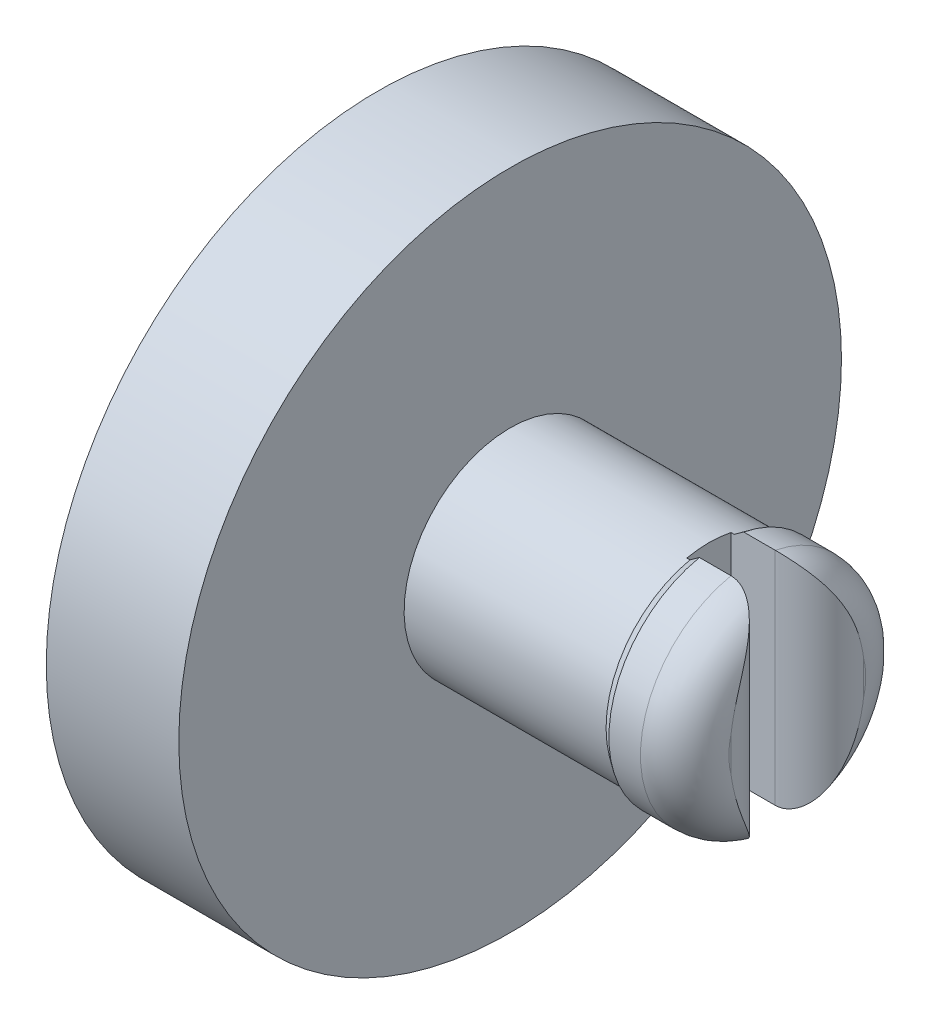
ISO-10303-21;
HEADER;
FILE_DESCRIPTION(('STEP AP214'),'2;1');
FILE_NAME('part.step','',(''),(''),'','','');
FILE_SCHEMA(('AUTOMOTIVE_DESIGN { 1 0 10303 214 1 1 1 1 }'));
ENDSEC;
DATA;
#1=APPLICATION_CONTEXT('core data for automotive mechanical design processes');
#2=APPLICATION_PROTOCOL_DEFINITION('international standard','automotive_design',2000,#1);
#3=PRODUCT_CONTEXT('',#1,'mechanical');
#4=PRODUCT('Part','Part','',(#3));
#5=PRODUCT_RELATED_PRODUCT_CATEGORY('part','',(#4));
#6=PRODUCT_DEFINITION_FORMATION('','',#4);
#7=PRODUCT_DEFINITION_CONTEXT('part definition',#1,'design');
#8=PRODUCT_DEFINITION('design','',#6,#7);
#9=PRODUCT_DEFINITION_SHAPE('','',#8);
#10=(LENGTH_UNIT() NAMED_UNIT(*) SI_UNIT(.MILLI.,.METRE.));
#11=(NAMED_UNIT(*) PLANE_ANGLE_UNIT() SI_UNIT($,.RADIAN.));
#12=(NAMED_UNIT(*) SI_UNIT($,.STERADIAN.) SOLID_ANGLE_UNIT());
#13=UNCERTAINTY_MEASURE_WITH_UNIT(LENGTH_MEASURE(1.E-05),#10,'distance_accuracy_value','');
#14=(GEOMETRIC_REPRESENTATION_CONTEXT(3) GLOBAL_UNCERTAINTY_ASSIGNED_CONTEXT((#13)) GLOBAL_UNIT_ASSIGNED_CONTEXT((#10,
#11,#12)) REPRESENTATION_CONTEXT('',''));
#15=CARTESIAN_POINT('',(0.,0.,0.));
#16=DIRECTION('',(0.,0.,1.));
#17=DIRECTION('',(1.,0.,0.));
#18=AXIS2_PLACEMENT_3D('',#15,#16,#17);
#19=CARTESIAN_POINT('',(3.,0.,0.));
#20=DIRECTION('',(-1.,0.,0.));
#21=DIRECTION('',(0.,0.,1.));
#22=AXIS2_PLACEMENT_3D('',#19,#20,#21);
#23=CYLINDRICAL_SURFACE('',#22,7.5);
#24=CARTESIAN_POINT('',(3.,0.,0.));
#25=DIRECTION('',(1.,0.,0.));
#26=DIRECTION('',(0.,0.,-1.));
#27=AXIS2_PLACEMENT_3D('',#24,#25,#26);
#28=CIRCLE('',#27,7.5);
#29=CARTESIAN_POINT('',(3.,0.,-7.5));
#30=VERTEX_POINT('',#29);
#31=EDGE_CURVE('E318',#30,#30,#28,.T.);
#32=ORIENTED_EDGE('',*,*,#31,.F.);
#33=EDGE_LOOP('',(#32));
#34=FACE_BOUND('',#33,.T.);
#35=CARTESIAN_POINT('',(0.,0.,0.));
#36=DIRECTION('',(1.,0.,0.));
#37=DIRECTION('',(0.,0.,-1.));
#38=AXIS2_PLACEMENT_3D('',#35,#36,#37);
#39=CIRCLE('',#38,7.5);
#40=CARTESIAN_POINT('',(0.,0.,-7.5));
#41=VERTEX_POINT('',#40);
#42=EDGE_CURVE('E314',#41,#41,#39,.T.);
#43=ORIENTED_EDGE('',*,*,#42,.T.);
#44=EDGE_LOOP('',(#43));
#45=FACE_BOUND('',#44,.T.);
#46=ADVANCED_FACE('F47',(#34,#45),#23,.T.);
#47=CARTESIAN_POINT('',(3.,0.,0.));
#48=DIRECTION('',(1.,0.,0.));
#49=DIRECTION('',(0.,0.,-1.));
#50=AXIS2_PLACEMENT_3D('',#47,#48,#49);
#51=PLANE('',#50);
#52=CARTESIAN_POINT('',(3.,0.,0.));
#53=DIRECTION('',(1.,0.,0.));
#54=DIRECTION('',(0.,0.,-1.));
#55=AXIS2_PLACEMENT_3D('',#52,#53,#54);
#56=CIRCLE('',#55,2.4);
#57=CARTESIAN_POINT('',(3.,0.,-2.4));
#58=VERTEX_POINT('',#57);
#59=EDGE_CURVE('E299',#58,#58,#56,.T.);
#60=ORIENTED_EDGE('',*,*,#59,.F.);
#61=EDGE_LOOP('',(#60));
#62=FACE_BOUND('',#61,.T.);
#63=ORIENTED_EDGE('',*,*,#31,.T.);
#64=EDGE_LOOP('',(#63));
#65=FACE_BOUND('',#64,.T.);
#66=ADVANCED_FACE('F267',(#62,#65),#51,.T.);
#67=CARTESIAN_POINT('',(0.,0.,0.));
#68=DIRECTION('',(1.,0.,0.));
#69=DIRECTION('',(0.,0.,-1.));
#70=AXIS2_PLACEMENT_3D('',#67,#68,#69);
#71=PLANE('',#70);
#72=ORIENTED_EDGE('',*,*,#42,.F.);
#73=EDGE_LOOP('',(#72));
#74=FACE_BOUND('',#73,.T.);
#75=ADVANCED_FACE('F269',(#74),#71,.F.);
#76=CARTESIAN_POINT('',(7.5,0.,0.));
#77=DIRECTION('',(-1.,0.,0.));
#78=DIRECTION('',(0.,0.,1.));
#79=AXIS2_PLACEMENT_3D('',#76,#77,#78);
#80=CYLINDRICAL_SURFACE('',#79,2.4);
#81=CARTESIAN_POINT('',(7.5,0.,0.));
#82=DIRECTION('',(1.,0.,0.));
#83=DIRECTION('',(0.,0.,-1.));
#84=AXIS2_PLACEMENT_3D('',#81,#82,#83);
#85=CIRCLE('',#84,2.4);
#86=CARTESIAN_POINT('',(7.5,2.3473389188611,-0.500000000000001));
#87=VERTEX_POINT('',#86);
#88=CARTESIAN_POINT('',(7.5,2.3473389188611,0.499999999999999));
#89=VERTEX_POINT('',#88);
#90=EDGE_CURVE('E285',#87,#89,#85,.T.);
#91=ORIENTED_EDGE('',*,*,#90,.F.);
#92=DIRECTION('',(-1.,0.,0.));
#93=VECTOR('',#92,1.);
#94=CARTESIAN_POINT('',(7.57140740033711,2.3473389188611,-0.500000000000001));
#95=LINE('',#94,#93);
#96=CARTESIAN_POINT('',(7.57140740033711,2.3473389188611,-0.500000000000001));
#97=VERTEX_POINT('',#96);
#98=EDGE_CURVE('E77',#97,#87,#95,.T.);
#99=ORIENTED_EDGE('',*,*,#98,.F.);
#100=CARTESIAN_POINT('',(7.57140740033711,0.,0.));
#101=DIRECTION('',(1.,0.,0.));
#102=DIRECTION('',(0.,0.,-1.));
#103=AXIS2_PLACEMENT_3D('',#100,#101,#102);
#104=CIRCLE('',#103,2.4);
#105=CARTESIAN_POINT('',(7.57140740033711,-2.3473389188611,-0.500000000000001));
#106=VERTEX_POINT('',#105);
#107=EDGE_CURVE('E59',#97,#106,#104,.F.);
#108=ORIENTED_EDGE('',*,*,#107,.T.);
#109=DIRECTION('',(-1.,0.,0.));
#110=VECTOR('',#109,1.);
#111=CARTESIAN_POINT('',(7.5,-2.3473389188611,-0.500000000000001));
#112=LINE('',#111,#110);
#113=CARTESIAN_POINT('',(7.5,-2.3473389188611,-0.500000000000001));
#114=VERTEX_POINT('',#113);
#115=EDGE_CURVE('E179',#114,#106,#112,.F.);
#116=ORIENTED_EDGE('',*,*,#115,.F.);
#117=CARTESIAN_POINT('',(7.5,-2.3473389188611,0.499999999999999));
#118=VERTEX_POINT('',#117);
#119=EDGE_CURVE('E103',#118,#114,#85,.T.);
#120=ORIENTED_EDGE('',*,*,#119,.F.);
#121=DIRECTION('',(-1.,0.,0.));
#122=VECTOR('',#121,1.);
#123=CARTESIAN_POINT('',(7.57140740033711,-2.3473389188611,0.499999999999999));
#124=LINE('',#123,#122);
#125=CARTESIAN_POINT('',(7.57140740033711,-2.3473389188611,0.499999999999999));
#126=VERTEX_POINT('',#125);
#127=EDGE_CURVE('E97',#126,#118,#124,.T.);
#128=ORIENTED_EDGE('',*,*,#127,.F.);
#129=CARTESIAN_POINT('',(7.57140740033711,0.,0.));
#130=DIRECTION('',(1.,0.,0.));
#131=DIRECTION('',(0.,0.,-1.));
#132=AXIS2_PLACEMENT_3D('',#129,#130,#131);
#133=CIRCLE('',#132,2.4);
#134=CARTESIAN_POINT('',(7.57140740033711,2.3473389188611,0.499999999999999));
#135=VERTEX_POINT('',#134);
#136=EDGE_CURVE('E11',#126,#135,#133,.F.);
#137=ORIENTED_EDGE('',*,*,#136,.T.);
#138=DIRECTION('',(-1.,0.,0.));
#139=VECTOR('',#138,1.);
#140=CARTESIAN_POINT('',(7.5,2.3473389188611,0.499999999999999));
#141=LINE('',#140,#139);
#142=EDGE_CURVE('E66',#89,#135,#141,.F.);
#143=ORIENTED_EDGE('',*,*,#142,.F.);
#144=EDGE_LOOP('',(#91,#99,#108,#116,#120,#128,#137,#143));
#145=FACE_BOUND('',#144,.T.);
#146=ORIENTED_EDGE('',*,*,#59,.T.);
#147=EDGE_LOOP('',(#146));
#148=FACE_BOUND('',#147,.T.);
#149=ADVANCED_FACE('F99',(#145,#148),#80,.T.);
#150=CARTESIAN_POINT('',(7.5,0.,0.));
#151=DIRECTION('',(1.,0.,0.));
#152=DIRECTION('',(0.,0.,-1.));
#153=AXIS2_PLACEMENT_3D('',#150,#151,#152);
#154=PLANE('',#153);
#155=DIRECTION('',(0.,1.,0.));
#156=VECTOR('',#155,1.);
#157=CARTESIAN_POINT('',(7.5,-2.50049995001,0.499999999999999));
#158=LINE('',#157,#156);
#159=EDGE_CURVE('E283',#118,#89,#158,.T.);
#160=ORIENTED_EDGE('',*,*,#159,.F.);
#161=ORIENTED_EDGE('',*,*,#119,.T.);
#162=DIRECTION('',(0.,-1.,0.));
#163=VECTOR('',#162,1.);
#164=CARTESIAN_POINT('',(7.5,2.50049995001,-0.500000000000001));
#165=LINE('',#164,#163);
#166=EDGE_CURVE('E291',#87,#114,#165,.T.);
#167=ORIENTED_EDGE('',*,*,#166,.F.);
#168=ORIENTED_EDGE('',*,*,#90,.T.);
#169=EDGE_LOOP('',(#160,#161,#167,#168));
#170=FACE_BOUND('',#169,.T.);
#171=ADVANCED_FACE('F156',(#170),#154,.T.);
#172=CARTESIAN_POINT('',(9.5,0.,0.));
#173=DIRECTION('',(-1.,0.,0.));
#174=DIRECTION('',(0.,0.,1.));
#175=AXIS2_PLACEMENT_3D('',#172,#173,#174);
#176=CYLINDRICAL_SURFACE('',#175,2.55);
#177=DIRECTION('',(-1.,0.,0.));
#178=VECTOR('',#177,1.);
#179=CARTESIAN_POINT('',(9.5,-2.50049995001,-0.500000000000001));
#180=LINE('',#179,#178);
#181=CARTESIAN_POINT('',(8.5,-2.50049995001,-0.500000000000001));
#182=VERTEX_POINT('',#181);
#183=CARTESIAN_POINT('',(7.78562960134843,-2.50049995001,-0.500000000000001));
#184=VERTEX_POINT('',#183);
#185=EDGE_CURVE('E305',#182,#184,#180,.T.);
#186=ORIENTED_EDGE('',*,*,#185,.T.);
#187=CARTESIAN_POINT('',(7.78562960134843,0.,0.));
#188=DIRECTION('',(1.,0.,0.));
#189=DIRECTION('',(0.,0.,-1.));
#190=AXIS2_PLACEMENT_3D('',#187,#188,#189);
#191=CIRCLE('',#190,2.55);
#192=CARTESIAN_POINT('',(7.78562960134843,2.50049995001,-0.500000000000001));
#193=VERTEX_POINT('',#192);
#194=EDGE_CURVE('E215',#184,#193,#191,.T.);
#195=ORIENTED_EDGE('',*,*,#194,.T.);
#196=DIRECTION('',(-1.,0.,0.));
#197=VECTOR('',#196,1.);
#198=CARTESIAN_POINT('',(9.5,2.50049995001,-0.500000000000001));
#199=LINE('',#198,#197);
#200=CARTESIAN_POINT('',(8.5,2.50049995001,-0.500000000000001));
#201=VERTEX_POINT('',#200);
#202=EDGE_CURVE('E252',#201,#193,#199,.T.);
#203=ORIENTED_EDGE('',*,*,#202,.F.);
#204=CARTESIAN_POINT('',(8.5,0.,0.));
#205=DIRECTION('',(1.,0.,0.));
#206=DIRECTION('',(0.,0.,-1.));
#207=AXIS2_PLACEMENT_3D('',#204,#205,#206);
#208=CIRCLE('',#207,2.55);
#209=EDGE_CURVE('E218',#201,#182,#208,.F.);
#210=ORIENTED_EDGE('',*,*,#209,.T.);
#211=EDGE_LOOP('',(#186,#195,#203,#210));
#212=FACE_BOUND('',#211,.T.);
#213=ADVANCED_FACE('F152',(#212),#176,.T.);
#214=CARTESIAN_POINT('',(9.5,2.50049995001,-0.500000000000001));
#215=DIRECTION('',(0.,0.,-1.));
#216=DIRECTION('',(-1.,0.,0.));
#217=AXIS2_PLACEMENT_3D('',#214,#215,#216);
#218=PLANE('',#217);
#219=CARTESIAN_POINT('',(7.78562960134843,2.50049995001,-0.500000000000001));
#220=CARTESIAN_POINT('',(7.73799603494508,2.46648873898344,-0.500000000000001));
#221=CARTESIAN_POINT('',(7.69037678513601,2.4324575128124,-0.500000000000001));
#222=CARTESIAN_POINT('',(7.59516691801945,2.36435502968998,-0.500000000000001));
#223=CARTESIAN_POINT('',(7.54757630071238,2.33028377273802,-0.500000000000001));
#224=CARTESIAN_POINT('',(7.5,2.296192500641,-0.500000000000001));
#225=B_SPLINE_CURVE_WITH_KNOTS('',3,(#219,#220,#221,#222,#223,#224),.UNSPECIFIED.,.F.,.F.,(4,2,
4),(0.,0.175588882802255,0.351177768138415),.UNSPECIFIED.);
#226=EDGE_CURVE('E173',#193,#97,#225,.T.);
#227=ORIENTED_EDGE('',*,*,#226,.T.);
#228=ORIENTED_EDGE('',*,*,#98,.T.);
#229=ORIENTED_EDGE('',*,*,#166,.T.);
#230=ORIENTED_EDGE('',*,*,#115,.T.);
#231=CARTESIAN_POINT('',(7.5,-2.296192500641,-0.500000000000001));
#232=CARTESIAN_POINT('',(7.54757630071238,-2.33028377273802,-0.500000000000001));
#233=CARTESIAN_POINT('',(7.59516691801945,-2.36435502968998,-0.500000000000001));
#234=CARTESIAN_POINT('',(7.69037678513601,-2.4324575128124,-0.500000000000001));
#235=CARTESIAN_POINT('',(7.73799603494508,-2.46648873898344,-0.500000000000001));
#236=CARTESIAN_POINT('',(7.78562960134843,-2.50049995001,-0.500000000000001));
#237=B_SPLINE_CURVE_WITH_KNOTS('',3,(#231,#232,#233,#234,#235,#236),.UNSPECIFIED.,.F.,.F.,(4,2,
4),(0.,0.175588885336159,0.351177768138415),.UNSPECIFIED.);
#238=EDGE_CURVE('E165',#106,#184,#237,.T.);
#239=ORIENTED_EDGE('',*,*,#238,.T.);
#240=ORIENTED_EDGE('',*,*,#185,.F.);
#241=DIRECTION('',(0.,-1.,0.));
#242=VECTOR('',#241,1.);
#243=CARTESIAN_POINT('',(8.5,2.50049995001,-0.500000000000001));
#244=LINE('',#243,#242);
#245=EDGE_CURVE('E226',#182,#201,#244,.F.);
#246=ORIENTED_EDGE('',*,*,#245,.T.);
#247=ORIENTED_EDGE('',*,*,#202,.T.);
#248=EDGE_LOOP('',(#227,#228,#229,#230,#239,#240,#246,#247));
#249=FACE_BOUND('',#248,.T.);
#250=ADVANCED_FACE('F155',(#249),#218,.F.);
#251=CARTESIAN_POINT('',(9.5,0.,0.));
#252=DIRECTION('',(1.,0.,0.));
#253=DIRECTION('',(0.,0.,-1.));
#254=AXIS2_PLACEMENT_3D('',#251,#252,#253);
#255=PLANE('',#254);
#256=CARTESIAN_POINT('',(9.5,0.,0.));
#257=DIRECTION('',(1.,0.,0.));
#258=DIRECTION('',(0.,0.,-1.));
#259=AXIS2_PLACEMENT_3D('',#256,#257,#258);
#260=CIRCLE('',#259,1.55);
#261=CARTESIAN_POINT('',(9.5,-0.390512483812212,-1.49999999999561));
#262=VERTEX_POINT('',#261);
#263=CARTESIAN_POINT('',(9.5,0.390512483812212,-1.49999999999561));
#264=VERTEX_POINT('',#263);
#265=EDGE_CURVE('E238',#262,#264,#260,.T.);
#266=ORIENTED_EDGE('',*,*,#265,.T.);
#267=DIRECTION('',(0.,-1.,0.));
#268=VECTOR('',#267,1.);
#269=CARTESIAN_POINT('',(9.5,-2.50049995001,-1.5));
#270=LINE('',#269,#268);
#271=EDGE_CURVE('E232',#264,#262,#270,.T.);
#272=ORIENTED_EDGE('',*,*,#271,.T.);
#273=EDGE_LOOP('',(#266,#272));
#274=FACE_BOUND('',#273,.T.);
#275=ADVANCED_FACE('F150',(#274),#255,.T.);
#276=CARTESIAN_POINT('',(9.5,0.,0.));
#277=DIRECTION('',(-1.,0.,0.));
#278=DIRECTION('',(0.,0.,1.));
#279=AXIS2_PLACEMENT_3D('',#276,#277,#278);
#280=CYLINDRICAL_SURFACE('',#279,2.55);
#281=DIRECTION('',(-1.,0.,0.));
#282=VECTOR('',#281,1.);
#283=CARTESIAN_POINT('',(9.5,2.50049995001,0.499999999999999));
#284=LINE('',#283,#282);
#285=CARTESIAN_POINT('',(8.5,2.50049995001,0.499999999999999));
#286=VERTEX_POINT('',#285);
#287=CARTESIAN_POINT('',(7.78562960134843,2.50049995001,0.499999999999999));
#288=VERTEX_POINT('',#287);
#289=EDGE_CURVE('E302',#286,#288,#284,.T.);
#290=ORIENTED_EDGE('',*,*,#289,.T.);
#291=CARTESIAN_POINT('',(7.78562960134843,0.,0.));
#292=DIRECTION('',(1.,0.,0.));
#293=DIRECTION('',(0.,0.,-1.));
#294=AXIS2_PLACEMENT_3D('',#291,#292,#293);
#295=CIRCLE('',#294,2.55);
#296=CARTESIAN_POINT('',(7.78562960134843,-2.50049995001,0.499999999999999));
#297=VERTEX_POINT('',#296);
#298=EDGE_CURVE('E121',#288,#297,#295,.T.);
#299=ORIENTED_EDGE('',*,*,#298,.T.);
#300=DIRECTION('',(-1.,0.,0.));
#301=VECTOR('',#300,1.);
#302=CARTESIAN_POINT('',(9.5,-2.50049995001,0.499999999999999));
#303=LINE('',#302,#301);
#304=CARTESIAN_POINT('',(8.5,-2.50049995001,0.499999999999999));
#305=VERTEX_POINT('',#304);
#306=EDGE_CURVE('E113',#305,#297,#303,.T.);
#307=ORIENTED_EDGE('',*,*,#306,.F.);
#308=CARTESIAN_POINT('',(8.5,0.,0.));
#309=DIRECTION('',(1.,0.,0.));
#310=DIRECTION('',(0.,0.,-1.));
#311=AXIS2_PLACEMENT_3D('',#308,#309,#310);
#312=CIRCLE('',#311,2.55);
#313=EDGE_CURVE('E242',#305,#286,#312,.F.);
#314=ORIENTED_EDGE('',*,*,#313,.T.);
#315=EDGE_LOOP('',(#290,#299,#307,#314));
#316=FACE_BOUND('',#315,.T.);
#317=ADVANCED_FACE('F141',(#316),#280,.T.);
#318=CARTESIAN_POINT('',(9.5,-2.50049995001,0.499999999999999));
#319=DIRECTION('',(0.,0.,1.));
#320=DIRECTION('',(1.,0.,0.));
#321=AXIS2_PLACEMENT_3D('',#318,#319,#320);
#322=PLANE('',#321);
#323=CARTESIAN_POINT('',(7.78562960134843,-2.50049995001,0.499999999999999));
#324=CARTESIAN_POINT('',(7.73799603494508,-2.46648873898344,0.499999999999999));
#325=CARTESIAN_POINT('',(7.69037678513601,-2.4324575128124,0.499999999999999));
#326=CARTESIAN_POINT('',(7.59516691801945,-2.36435502968998,0.499999999999999));
#327=CARTESIAN_POINT('',(7.54757630071238,-2.33028377273802,0.499999999999999));
#328=CARTESIAN_POINT('',(7.5,-2.296192500641,0.499999999999999));
#329=B_SPLINE_CURVE_WITH_KNOTS('',3,(#323,#324,#325,#326,#327,#328),.UNSPECIFIED.,.F.,.F.,(4,2,
4),(0.,0.175588882802255,0.351177768138414),.UNSPECIFIED.);
#330=EDGE_CURVE('E107',#297,#126,#329,.T.);
#331=ORIENTED_EDGE('',*,*,#330,.T.);
#332=ORIENTED_EDGE('',*,*,#127,.T.);
#333=ORIENTED_EDGE('',*,*,#159,.T.);
#334=ORIENTED_EDGE('',*,*,#142,.T.);
#335=CARTESIAN_POINT('',(7.5,2.29619250064101,0.499999999999999));
#336=CARTESIAN_POINT('',(7.54757630071238,2.33028377273802,0.499999999999999));
#337=CARTESIAN_POINT('',(7.59516691801945,2.36435502968999,0.499999999999999));
#338=CARTESIAN_POINT('',(7.69037678513601,2.43245751281241,0.499999999999999));
#339=CARTESIAN_POINT('',(7.73799603494508,2.46648873898344,0.499999999999999));
#340=CARTESIAN_POINT('',(7.78562960134843,2.50049995001,0.499999999999999));
#341=B_SPLINE_CURVE_WITH_KNOTS('',3,(#335,#336,#337,#338,#339,#340),.UNSPECIFIED.,.F.,.F.,(4,2,
4),(0.,0.175588885336159,0.351177768138414),.UNSPECIFIED.);
#342=EDGE_CURVE('E120',#135,#288,#341,.T.);
#343=ORIENTED_EDGE('',*,*,#342,.T.);
#344=ORIENTED_EDGE('',*,*,#289,.F.);
#345=DIRECTION('',(0.,1.,0.));
#346=VECTOR('',#345,1.);
#347=CARTESIAN_POINT('',(8.5,-2.50049995001,0.499999999999999));
#348=LINE('',#347,#346);
#349=EDGE_CURVE('E328',#286,#305,#348,.F.);
#350=ORIENTED_EDGE('',*,*,#349,.T.);
#351=ORIENTED_EDGE('',*,*,#306,.T.);
#352=EDGE_LOOP('',(#331,#332,#333,#334,#343,#344,#350,#351));
#353=FACE_BOUND('',#352,.T.);
#354=ADVANCED_FACE('F110',(#353),#322,.F.);
#355=CARTESIAN_POINT('',(9.5,0.,0.));
#356=DIRECTION('',(1.,0.,0.));
#357=DIRECTION('',(0.,0.,-1.));
#358=AXIS2_PLACEMENT_3D('',#355,#356,#357);
#359=PLANE('',#358);
#360=CARTESIAN_POINT('',(9.5,0.,0.));
#361=DIRECTION('',(1.,0.,0.));
#362=DIRECTION('',(0.,0.,-1.));
#363=AXIS2_PLACEMENT_3D('',#360,#361,#362);
#364=CIRCLE('',#363,1.55);
#365=CARTESIAN_POINT('',(9.5,0.39051248381222,1.4999999999956));
#366=VERTEX_POINT('',#365);
#367=CARTESIAN_POINT('',(9.5,-0.39051248381222,1.4999999999956));
#368=VERTEX_POINT('',#367);
#369=EDGE_CURVE('E290',#366,#368,#364,.T.);
#370=ORIENTED_EDGE('',*,*,#369,.T.);
#371=DIRECTION('',(0.,1.,0.));
#372=VECTOR('',#371,1.);
#373=CARTESIAN_POINT('',(9.5,2.50049995001,1.5));
#374=LINE('',#373,#372);
#375=EDGE_CURVE('E296',#368,#366,#374,.T.);
#376=ORIENTED_EDGE('',*,*,#375,.T.);
#377=EDGE_LOOP('',(#370,#376));
#378=FACE_BOUND('',#377,.T.);
#379=ADVANCED_FACE('F140',(#378),#359,.T.);
#380=CARTESIAN_POINT('',(8.5,0.,0.));
#381=DIRECTION('',(1.,0.,0.));
#382=DIRECTION('',(0.,0.,-1.));
#383=AXIS2_PLACEMENT_3D('',#380,#381,#382);
#384=TOROIDAL_SURFACE('',#383,1.55,1.);
#385=CARTESIAN_POINT('',(8.5,2.50049995001,0.499999999999999));
#386=CARTESIAN_POINT('',(8.52062037812451,2.50050262481934,0.499996815981459));
#387=CARTESIAN_POINT('',(8.54122738672376,2.49972131781612,0.500638435365421));
#388=CARTESIAN_POINT('',(8.58223103772199,2.49662410586011,0.50317569670102));
#389=CARTESIAN_POINT('',(8.60262784180595,2.49430948630705,0.505070288264396));
#390=CARTESIAN_POINT('',(8.66287019167039,2.48517574092105,0.51253114662379));
#391=CARTESIAN_POINT('',(8.70219184922865,2.47616515120073,0.519876100327871));
#392=CARTESIAN_POINT('',(8.77804017934073,2.45294819674788,0.538635507971327));
#393=CARTESIAN_POINT('',(8.81457467282006,2.43875706995295,0.550038024613098));
#394=CARTESIAN_POINT('',(8.88442351779282,2.40595711760122,0.576088569155384));
#395=CARTESIAN_POINT('',(8.91772998418651,2.38733784008625,0.59074427014983));
#396=CARTESIAN_POINT('',(8.99384680600395,2.33801444662052,0.629019136575283));
#397=CARTESIAN_POINT('',(9.03487653673112,2.30549970294828,0.653836081497237));
#398=CARTESIAN_POINT('',(9.10994399010374,2.2351174345998,0.706229167768838));
#399=CARTESIAN_POINT('',(9.14396856029015,2.19724006230109,0.7338103573744));
#400=CARTESIAN_POINT('',(9.22176695376173,2.09666839581951,0.80494094517632));
#401=CARTESIAN_POINT('',(9.26136048052717,2.03133964964426,0.849311183475504));
#402=CARTESIAN_POINT('',(9.32859369432637,1.89447274358894,0.937409900698313));
#403=CARTESIAN_POINT('',(9.35620649945363,1.82292104795453,0.981136725914945));
#404=CARTESIAN_POINT('',(9.41207075004341,1.64322892360475,1.08417550983467));
#405=CARTESIAN_POINT('',(9.43537367331539,1.53271318976298,1.14199154682244));
#406=CARTESIAN_POINT('',(9.46924640739032,1.30545924867845,1.24774428955149));
#407=CARTESIAN_POINT('',(9.47981692414304,1.18872138679712,1.29568154290092));
#408=CARTESIAN_POINT('',(9.49359295907356,0.950328372084177,1.37927469357639));
#409=CARTESIAN_POINT('',(9.49678904542798,0.828667124314529,1.41491481352631));
#410=CARTESIAN_POINT('',(9.49926965669103,0.638681349319053,1.45886084571995));
#411=CARTESIAN_POINT('',(9.49967610051195,0.57149904069477,1.47220519531089));
#412=CARTESIAN_POINT('',(9.49995383550824,0.470390174861513,1.4889113703425));
#413=CARTESIAN_POINT('',(9.49999147697437,0.436734370863143,1.49391809796408));
#414=CARTESIAN_POINT('',(9.49999956818036,0.398843540183908,1.49892478572292));
#415=CARTESIAN_POINT('',(9.49999999337563,0.394678537258117,1.49946659638414));
#416=CARTESIAN_POINT('',(9.5,0.390512483795335,1.5));
#417=B_SPLINE_CURVE_WITH_KNOTS('',3,(#385,#386,#387,#388,#389,#390,#391,#392,#393,#394,#395,
#396,#397,#398,#399,#400,#401,#402,#403,#404,#405,#406,#407,#408,#409,#410,#411,#412,#413,#414,
#415,#416),.UNSPECIFIED.,.F.,.F.,(4,2,2,2,2,2,2,2,2,2,2,2,2,2,2,4),(0.,0.061811113426031,
0.123570475098421,0.24583765459185,0.367748059773727,0.489949122313512,0.66278628635283,
0.835945057606503,1.0994809865549,1.36360520782335,1.74263812154261,2.12165001877019,
2.50114640039199,2.70650559920153,2.80856512849222,2.82116538155942),.UNSPECIFIED.);
#418=EDGE_CURVE('E214',#286,#366,#417,.T.);
#419=ORIENTED_EDGE('',*,*,#418,.F.);
#420=ORIENTED_EDGE('',*,*,#313,.F.);
#421=CARTESIAN_POINT('',(8.5,-2.50049995001,0.499999999999999));
#422=CARTESIAN_POINT('',(8.52062037812451,-2.50050262481934,0.499996815981459));
#423=CARTESIAN_POINT('',(8.54122738672376,-2.49972131781612,0.500638435365421));
#424=CARTESIAN_POINT('',(8.58223103772199,-2.49662410586011,0.50317569670102));
#425=CARTESIAN_POINT('',(8.60262784180595,-2.49430948630705,0.505070288264396));
#426=CARTESIAN_POINT('',(8.66287019167039,-2.48517574092105,0.51253114662379));
#427=CARTESIAN_POINT('',(8.70219184922865,-2.47616515120073,0.519876100327871));
#428=CARTESIAN_POINT('',(8.77804017934073,-2.45294819674788,0.538635507971327));
#429=CARTESIAN_POINT('',(8.81457467282006,-2.43875706995295,0.550038024613098));
#430=CARTESIAN_POINT('',(8.88442351779282,-2.40595711760122,0.576088569155384));
#431=CARTESIAN_POINT('',(8.91772998418651,-2.38733784008625,0.59074427014983));
#432=CARTESIAN_POINT('',(8.99384680600395,-2.33801444662052,0.629019136575283));
#433=CARTESIAN_POINT('',(9.03487653673112,-2.30549970294828,0.653836081497237));
#434=CARTESIAN_POINT('',(9.10994399010374,-2.2351174345998,0.706229167768838));
#435=CARTESIAN_POINT('',(9.14396856029015,-2.19724006230109,0.7338103573744));
#436=CARTESIAN_POINT('',(9.22176695376173,-2.09666839581951,0.80494094517632));
#437=CARTESIAN_POINT('',(9.26136048052717,-2.03133964964426,0.849311183475504));
#438=CARTESIAN_POINT('',(9.32859369432637,-1.89447274358894,0.937409900698313));
#439=CARTESIAN_POINT('',(9.35620649945363,-1.82292104795453,0.981136725914945));
#440=CARTESIAN_POINT('',(9.41207075004341,-1.64322892360475,1.08417550983467));
#441=CARTESIAN_POINT('',(9.43537367331539,-1.53271318976298,1.14199154682244));
#442=CARTESIAN_POINT('',(9.46924640739032,-1.30545924867845,1.24774428955149));
#443=CARTESIAN_POINT('',(9.47981692414304,-1.18872138679712,1.29568154290092));
#444=CARTESIAN_POINT('',(9.49359295907356,-0.950328372084177,1.37927469357639));
#445=CARTESIAN_POINT('',(9.49678904542798,-0.828667124314529,1.41491481352631));
#446=CARTESIAN_POINT('',(9.49926965669103,-0.638681349319053,1.45886084571995));
#447=CARTESIAN_POINT('',(9.49967610051195,-0.57149904069477,1.47220519531089));
#448=CARTESIAN_POINT('',(9.49995383550824,-0.470390174861513,1.4889113703425));
#449=CARTESIAN_POINT('',(9.49999147697437,-0.436734370863143,1.49391809796408));
#450=CARTESIAN_POINT('',(9.49999956818036,-0.398843540183908,1.49892478572292));
#451=CARTESIAN_POINT('',(9.49999999337563,-0.394678537258117,1.49946659638414));
#452=CARTESIAN_POINT('',(9.5,-0.390512483795335,1.5));
#453=B_SPLINE_CURVE_WITH_KNOTS('',3,(#421,#422,#423,#424,#425,#426,#427,#428,#429,#430,#431,
#432,#433,#434,#435,#436,#437,#438,#439,#440,#441,#442,#443,#444,#445,#446,#447,#448,#449,#450,
#451,#452),.UNSPECIFIED.,.F.,.F.,(4,2,2,2,2,2,2,2,2,2,2,2,2,2,2,4),(0.,0.061811113426031,
0.123570475098421,0.24583765459185,0.367748059773727,0.489949122313512,0.66278628635283,
0.835945057606503,1.0994809865549,1.36360520782335,1.74263812154261,2.12165001877019,
2.50114640039199,2.70650559920153,2.80856512849222,2.82116538155942),.UNSPECIFIED.);
#454=EDGE_CURVE('E243',#368,#305,#453,.F.);
#455=ORIENTED_EDGE('',*,*,#454,.F.);
#456=ORIENTED_EDGE('',*,*,#369,.F.);
#457=EDGE_LOOP('',(#419,#420,#455,#456));
#458=FACE_BOUND('',#457,.T.);
#459=ADVANCED_FACE('F258',(#458),#384,.T.);
#460=CARTESIAN_POINT('',(8.5,0.,1.5));
#461=DIRECTION('',(0.,-1.,0.));
#462=DIRECTION('',(0.,0.,-1.));
#463=AXIS2_PLACEMENT_3D('',#460,#461,#462);
#464=CYLINDRICAL_SURFACE('',#463,1.);
#465=ORIENTED_EDGE('',*,*,#454,.T.);
#466=ORIENTED_EDGE('',*,*,#349,.F.);
#467=ORIENTED_EDGE('',*,*,#418,.T.);
#468=ORIENTED_EDGE('',*,*,#375,.F.);
#469=EDGE_LOOP('',(#465,#466,#467,#468));
#470=FACE_BOUND('',#469,.T.);
#471=ADVANCED_FACE('F194',(#470),#464,.T.);
#472=CARTESIAN_POINT('',(8.5,0.,0.));
#473=DIRECTION('',(1.,0.,0.));
#474=DIRECTION('',(0.,0.,-1.));
#475=AXIS2_PLACEMENT_3D('',#472,#473,#474);
#476=TOROIDAL_SURFACE('',#475,1.55,1.);
#477=CARTESIAN_POINT('',(8.5,-2.50049995001,-0.500000000000001));
#478=CARTESIAN_POINT('',(8.52062037812451,-2.50050262481934,-0.499996815981462));
#479=CARTESIAN_POINT('',(8.54122738672376,-2.49972131781612,-0.500638435365424));
#480=CARTESIAN_POINT('',(8.58223103772199,-2.49662410586011,-0.503175696701023));
#481=CARTESIAN_POINT('',(8.60262784180595,-2.49430948630705,-0.505070288264398));
#482=CARTESIAN_POINT('',(8.66287019167039,-2.48517574092105,-0.512531146623793));
#483=CARTESIAN_POINT('',(8.70219184922865,-2.47616515120073,-0.519876100327874));
#484=CARTESIAN_POINT('',(8.77804017934073,-2.45294819674788,-0.538635507971329));
#485=CARTESIAN_POINT('',(8.81457467282006,-2.43875706995294,-0.550038024613101));
#486=CARTESIAN_POINT('',(8.88442351779282,-2.40595711760122,-0.576088569155386));
#487=CARTESIAN_POINT('',(8.91772998418651,-2.38733784008625,-0.590744270149833));
#488=CARTESIAN_POINT('',(8.99384680600395,-2.33801444662052,-0.629019136575285));
#489=CARTESIAN_POINT('',(9.03487653673112,-2.30549970294828,-0.65383608149724));
#490=CARTESIAN_POINT('',(9.10994399010374,-2.2351174345998,-0.70622916776884));
#491=CARTESIAN_POINT('',(9.14396856029015,-2.19724006230109,-0.733810357374402));
#492=CARTESIAN_POINT('',(9.22176695376173,-2.09666839581951,-0.804940945176322));
#493=CARTESIAN_POINT('',(9.26136048052717,-2.03133964964426,-0.849311183475506));
#494=CARTESIAN_POINT('',(9.32859369432637,-1.89447274358894,-0.937409900698316));
#495=CARTESIAN_POINT('',(9.35620649945363,-1.82292104795453,-0.981136725914948));
#496=CARTESIAN_POINT('',(9.41207075004341,-1.64322892360475,-1.08417550983468));
#497=CARTESIAN_POINT('',(9.43537367331539,-1.53271318976298,-1.14199154682244));
#498=CARTESIAN_POINT('',(9.46924640739032,-1.30545924867845,-1.24774428955149));
#499=CARTESIAN_POINT('',(9.47981692414304,-1.18872138679712,-1.29568154290092));
#500=CARTESIAN_POINT('',(9.49359295907356,-0.950328372084175,-1.37927469357639));
#501=CARTESIAN_POINT('',(9.49678904542798,-0.828667124314527,-1.41491481352631));
#502=CARTESIAN_POINT('',(9.49926965669103,-0.638681349319049,-1.45886084571995));
#503=CARTESIAN_POINT('',(9.49967610051195,-0.571499040694766,-1.47220519531089));
#504=CARTESIAN_POINT('',(9.49995383550824,-0.470390174861508,-1.48891137034251));
#505=CARTESIAN_POINT('',(9.49999147697437,-0.436734370863137,-1.49391809796409));
#506=CARTESIAN_POINT('',(9.49999956818036,-0.398843540183901,-1.49892478572292));
#507=CARTESIAN_POINT('',(9.49999999337563,-0.394678537258109,-1.49946659638414));
#508=CARTESIAN_POINT('',(9.5,-0.390512483795327,-1.5));
#509=B_SPLINE_CURVE_WITH_KNOTS('',3,(#477,#478,#479,#480,#481,#482,#483,#484,#485,#486,#487,
#488,#489,#490,#491,#492,#493,#494,#495,#496,#497,#498,#499,#500,#501,#502,#503,#504,#505,#506,
#507,#508),.UNSPECIFIED.,.F.,.F.,(4,2,2,2,2,2,2,2,2,2,2,2,2,2,2,4),(0.,0.061811113426031,
0.123570475098421,0.24583765459185,0.367748059773728,0.489949122313512,0.66278628635283,
0.835945057606504,1.0994809865549,1.36360520782335,1.74263812154262,2.12165001877019,
2.50114640039199,2.70650559920153,2.80856512849222,2.82116538155943),.UNSPECIFIED.);
#510=EDGE_CURVE('E200',#182,#262,#509,.T.);
#511=ORIENTED_EDGE('',*,*,#510,.F.);
#512=ORIENTED_EDGE('',*,*,#209,.F.);
#513=CARTESIAN_POINT('',(8.5,2.50049995001,-0.500000000000001));
#514=CARTESIAN_POINT('',(8.52062037812451,2.50050262481934,-0.499996815981462));
#515=CARTESIAN_POINT('',(8.54122738672376,2.49972131781612,-0.500638435365424));
#516=CARTESIAN_POINT('',(8.58223103772199,2.49662410586011,-0.503175696701023));
#517=CARTESIAN_POINT('',(8.60262784180595,2.49430948630705,-0.505070288264398));
#518=CARTESIAN_POINT('',(8.66287019167039,2.48517574092105,-0.512531146623793));
#519=CARTESIAN_POINT('',(8.70219184922865,2.47616515120073,-0.519876100327874));
#520=CARTESIAN_POINT('',(8.77804017934073,2.45294819674788,-0.538635507971329));
#521=CARTESIAN_POINT('',(8.81457467282006,2.43875706995294,-0.550038024613101));
#522=CARTESIAN_POINT('',(8.88442351779282,2.40595711760122,-0.576088569155386));
#523=CARTESIAN_POINT('',(8.91772998418651,2.38733784008625,-0.590744270149833));
#524=CARTESIAN_POINT('',(8.99384680600395,2.33801444662052,-0.629019136575285));
#525=CARTESIAN_POINT('',(9.03487653673112,2.30549970294828,-0.65383608149724));
#526=CARTESIAN_POINT('',(9.10994399010374,2.2351174345998,-0.70622916776884));
#527=CARTESIAN_POINT('',(9.14396856029015,2.19724006230109,-0.733810357374402));
#528=CARTESIAN_POINT('',(9.22176695376173,2.09666839581951,-0.804940945176322));
#529=CARTESIAN_POINT('',(9.26136048052717,2.03133964964426,-0.849311183475506));
#530=CARTESIAN_POINT('',(9.32859369432637,1.89447274358894,-0.937409900698316));
#531=CARTESIAN_POINT('',(9.35620649945363,1.82292104795453,-0.981136725914948));
#532=CARTESIAN_POINT('',(9.41207075004341,1.64322892360475,-1.08417550983468));
#533=CARTESIAN_POINT('',(9.43537367331539,1.53271318976298,-1.14199154682244));
#534=CARTESIAN_POINT('',(9.46924640739032,1.30545924867845,-1.24774428955149));
#535=CARTESIAN_POINT('',(9.47981692414304,1.18872138679712,-1.29568154290092));
#536=CARTESIAN_POINT('',(9.49359295907356,0.950328372084175,-1.37927469357639));
#537=CARTESIAN_POINT('',(9.49678904542798,0.828667124314527,-1.41491481352631));
#538=CARTESIAN_POINT('',(9.49926965669103,0.638681349319049,-1.45886084571995));
#539=CARTESIAN_POINT('',(9.49967610051195,0.571499040694766,-1.47220519531089));
#540=CARTESIAN_POINT('',(9.49995383550824,0.470390174861508,-1.48891137034251));
#541=CARTESIAN_POINT('',(9.49999147697437,0.436734370863137,-1.49391809796409));
#542=CARTESIAN_POINT('',(9.49999956818036,0.398843540183901,-1.49892478572292));
#543=CARTESIAN_POINT('',(9.49999999337563,0.394678537258109,-1.49946659638414));
#544=CARTESIAN_POINT('',(9.5,0.390512483795327,-1.5));
#545=B_SPLINE_CURVE_WITH_KNOTS('',3,(#513,#514,#515,#516,#517,#518,#519,#520,#521,#522,#523,
#524,#525,#526,#527,#528,#529,#530,#531,#532,#533,#534,#535,#536,#537,#538,#539,#540,#541,#542,
#543,#544),.UNSPECIFIED.,.F.,.F.,(4,2,2,2,2,2,2,2,2,2,2,2,2,2,2,4),(0.,0.061811113426031,
0.123570475098421,0.24583765459185,0.367748059773728,0.489949122313512,0.66278628635283,
0.835945057606504,1.0994809865549,1.36360520782335,1.74263812154262,2.12165001877019,
2.50114640039199,2.70650559920153,2.80856512849222,2.82116538155943),.UNSPECIFIED.);
#546=EDGE_CURVE('E207',#264,#201,#545,.F.);
#547=ORIENTED_EDGE('',*,*,#546,.F.);
#548=ORIENTED_EDGE('',*,*,#265,.F.);
#549=EDGE_LOOP('',(#511,#512,#547,#548));
#550=FACE_BOUND('',#549,.T.);
#551=ADVANCED_FACE('F189',(#550),#476,.T.);
#552=CARTESIAN_POINT('',(8.5,0.,-1.5));
#553=DIRECTION('',(0.,1.,0.));
#554=DIRECTION('',(0.,0.,1.));
#555=AXIS2_PLACEMENT_3D('',#552,#553,#554);
#556=CYLINDRICAL_SURFACE('',#555,1.);
#557=ORIENTED_EDGE('',*,*,#546,.T.);
#558=ORIENTED_EDGE('',*,*,#245,.F.);
#559=ORIENTED_EDGE('',*,*,#510,.T.);
#560=ORIENTED_EDGE('',*,*,#271,.F.);
#561=EDGE_LOOP('',(#557,#558,#559,#560));
#562=FACE_BOUND('',#561,.T.);
#563=ADVANCED_FACE('F187',(#562),#556,.T.);
#564=CARTESIAN_POINT('',(7.78562960134843,0.,0.));
#565=DIRECTION('',(1.,0.,0.));
#566=DIRECTION('',(0.,0.,-1.));
#567=AXIS2_PLACEMENT_3D('',#564,#565,#566);
#568=CONICAL_SURFACE('',#567,2.55,0.610865238198011);
#569=ORIENTED_EDGE('',*,*,#238,.F.);
#570=ORIENTED_EDGE('',*,*,#107,.F.);
#571=ORIENTED_EDGE('',*,*,#226,.F.);
#572=ORIENTED_EDGE('',*,*,#194,.F.);
#573=EDGE_LOOP('',(#569,#570,#571,#572));
#574=FACE_BOUND('',#573,.T.);
#575=ADVANCED_FACE('F181',(#574),#568,.T.);
#576=CARTESIAN_POINT('',(7.78562960134843,0.,0.));
#577=DIRECTION('',(1.,0.,0.));
#578=DIRECTION('',(0.,0.,-1.));
#579=AXIS2_PLACEMENT_3D('',#576,#577,#578);
#580=CONICAL_SURFACE('',#579,2.55,0.610865238198011);
#581=ORIENTED_EDGE('',*,*,#342,.F.);
#582=ORIENTED_EDGE('',*,*,#136,.F.);
#583=ORIENTED_EDGE('',*,*,#330,.F.);
#584=ORIENTED_EDGE('',*,*,#298,.F.);
#585=EDGE_LOOP('',(#581,#582,#583,#584));
#586=FACE_BOUND('',#585,.T.);
#587=ADVANCED_FACE('F50',(#586),#580,.T.);
#588=CLOSED_SHELL('',(#46,#66,#75,#149,#171,#213,#250,#275,#317,#354,#379,#459,#471,#551,#563,
#575,#587));
#589=MANIFOLD_SOLID_BREP('B2',#588);
#590=ADVANCED_BREP_SHAPE_REPRESENTATION('',(#18,#589),#14);
#591=SHAPE_DEFINITION_REPRESENTATION(#9,#590);
ENDSEC;
END-ISO-10303-21;
